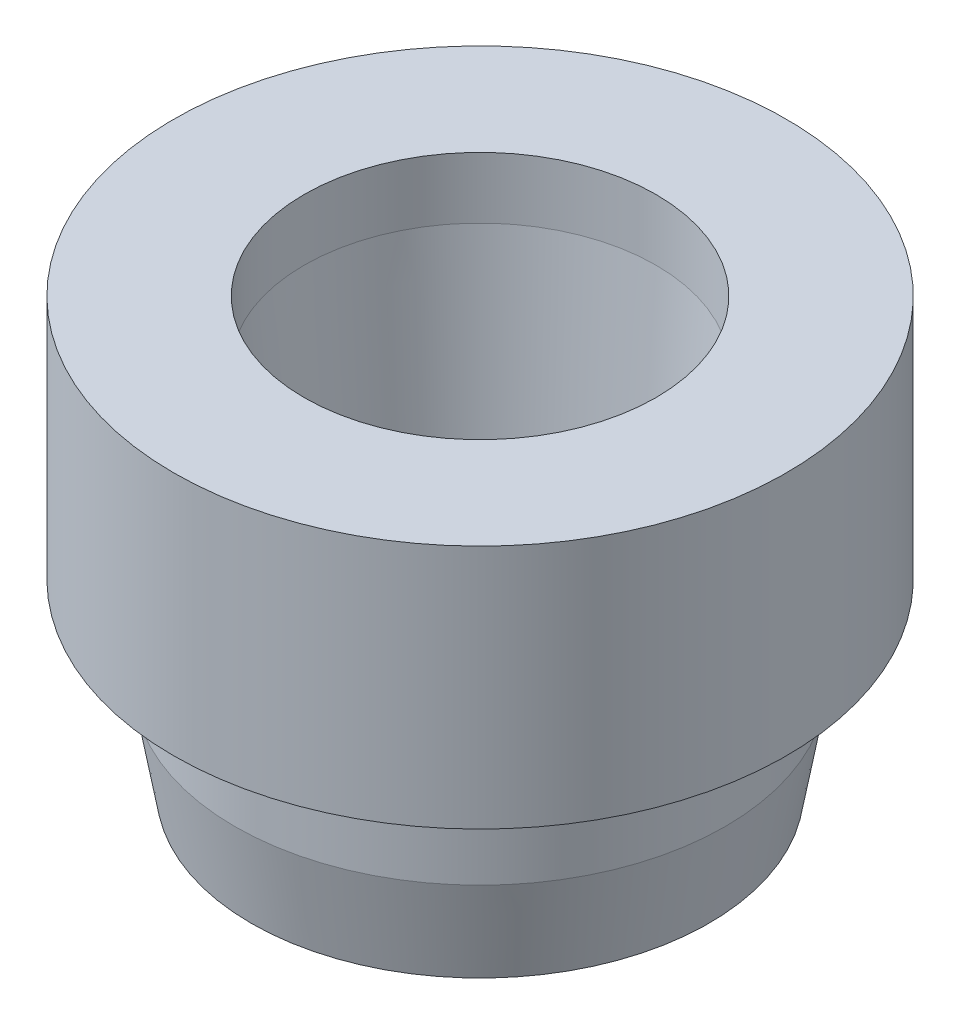
ISO-10303-21;
HEADER;
FILE_DESCRIPTION(('STEP AP214'),'2;1');
FILE_NAME('part.step','',(''),(''),'','','');
FILE_SCHEMA(('AUTOMOTIVE_DESIGN { 1 0 10303 214 1 1 1 1 }'));
ENDSEC;
DATA;
#1=APPLICATION_CONTEXT('core data for automotive mechanical design processes');
#2=APPLICATION_PROTOCOL_DEFINITION('international standard','automotive_design',2000,#1);
#3=PRODUCT_CONTEXT('',#1,'mechanical');
#4=PRODUCT('Part','Part','',(#3));
#5=PRODUCT_RELATED_PRODUCT_CATEGORY('part','',(#4));
#6=PRODUCT_DEFINITION_FORMATION('','',#4);
#7=PRODUCT_DEFINITION_CONTEXT('part definition',#1,'design');
#8=PRODUCT_DEFINITION('design','',#6,#7);
#9=PRODUCT_DEFINITION_SHAPE('','',#8);
#10=(LENGTH_UNIT() NAMED_UNIT(*) SI_UNIT(.MILLI.,.METRE.));
#11=(NAMED_UNIT(*) PLANE_ANGLE_UNIT() SI_UNIT($,.RADIAN.));
#12=(NAMED_UNIT(*) SI_UNIT($,.STERADIAN.) SOLID_ANGLE_UNIT());
#13=UNCERTAINTY_MEASURE_WITH_UNIT(LENGTH_MEASURE(1.E-05),#10,'distance_accuracy_value','');
#14=(GEOMETRIC_REPRESENTATION_CONTEXT(3) GLOBAL_UNCERTAINTY_ASSIGNED_CONTEXT((#13)) GLOBAL_UNIT_ASSIGNED_CONTEXT((#10,
#11,#12)) REPRESENTATION_CONTEXT('',''));
#15=CARTESIAN_POINT('',(0.,0.,0.));
#16=DIRECTION('',(0.,0.,1.));
#17=DIRECTION('',(1.,0.,0.));
#18=AXIS2_PLACEMENT_3D('',#15,#16,#17);
#19=CARTESIAN_POINT('',(-28.72,46.8801164725458,0.));
#20=DIRECTION('',(0.,1.,0.));
#21=DIRECTION('',(0.,0.,1.));
#22=AXIS2_PLACEMENT_3D('',#19,#20,#21);
#23=PLANE('',#22);
#24=CARTESIAN_POINT('',(0.,46.8801164725458,0.));
#25=DIRECTION('',(0.,1.,0.));
#26=DIRECTION('',(0.,0.,1.));
#27=AXIS2_PLACEMENT_3D('',#24,#25,#26);
#28=CIRCLE('',#27,50.);
#29=CARTESIAN_POINT('',(0.,46.8801164725458,50.));
#30=VERTEX_POINT('',#29);
#31=EDGE_CURVE('E10',#30,#30,#28,.T.);
#32=ORIENTED_EDGE('',*,*,#31,.T.);
#33=EDGE_LOOP('',(#32));
#34=FACE_BOUND('',#33,.T.);
#35=CARTESIAN_POINT('',(0.,46.8801164725458,0.));
#36=DIRECTION('',(0.,1.,0.));
#37=DIRECTION('',(0.,0.,1.));
#38=AXIS2_PLACEMENT_3D('',#35,#36,#37);
#39=CIRCLE('',#38,28.72);
#40=CARTESIAN_POINT('',(0.,46.8801164725458,28.72));
#41=VERTEX_POINT('',#40);
#42=EDGE_CURVE('E61',#41,#41,#39,.T.);
#43=ORIENTED_EDGE('',*,*,#42,.F.);
#44=EDGE_LOOP('',(#43));
#45=FACE_BOUND('',#44,.T.);
#46=ADVANCED_FACE('F30',(#34,#45),#23,.T.);
#47=CARTESIAN_POINT('',(0.,46.8801164725458,0.));
#48=DIRECTION('',(0.,1.,0.));
#49=DIRECTION('',(0.,0.,1.));
#50=AXIS2_PLACEMENT_3D('',#47,#48,#49);
#51=CYLINDRICAL_SURFACE('',#50,50.);
#52=CARTESIAN_POINT('',(0.,6.88011647254577,0.));
#53=DIRECTION('',(0.,1.,0.));
#54=DIRECTION('',(0.,0.,1.));
#55=AXIS2_PLACEMENT_3D('',#52,#53,#54);
#56=CIRCLE('',#55,50.);
#57=CARTESIAN_POINT('',(0.,6.88011647254577,50.));
#58=VERTEX_POINT('',#57);
#59=EDGE_CURVE('E36',#58,#58,#56,.T.);
#60=ORIENTED_EDGE('',*,*,#59,.T.);
#61=EDGE_LOOP('',(#60));
#62=FACE_BOUND('',#61,.T.);
#63=ORIENTED_EDGE('',*,*,#31,.F.);
#64=EDGE_LOOP('',(#63));
#65=FACE_BOUND('',#64,.T.);
#66=ADVANCED_FACE('F69',(#62,#65),#51,.T.);
#67=CARTESIAN_POINT('',(-50.,6.88011647254577,0.));
#68=DIRECTION('',(0.,-1.,0.));
#69=DIRECTION('',(0.,0.,-1.));
#70=AXIS2_PLACEMENT_3D('',#67,#68,#69);
#71=PLANE('',#70);
#72=CARTESIAN_POINT('',(0.,6.88011647254577,0.));
#73=DIRECTION('',(0.,1.,0.));
#74=DIRECTION('',(0.,0.,1.));
#75=AXIS2_PLACEMENT_3D('',#72,#73,#74);
#76=CIRCLE('',#75,40.);
#77=CARTESIAN_POINT('',(0.,6.88011647254577,40.));
#78=VERTEX_POINT('',#77);
#79=EDGE_CURVE('E40',#78,#78,#76,.T.);
#80=ORIENTED_EDGE('',*,*,#79,.T.);
#81=EDGE_LOOP('',(#80));
#82=FACE_BOUND('',#81,.T.);
#83=ORIENTED_EDGE('',*,*,#59,.F.);
#84=EDGE_LOOP('',(#83));
#85=FACE_BOUND('',#84,.T.);
#86=ADVANCED_FACE('F73',(#82,#85),#71,.T.);
#87=CARTESIAN_POINT('',(0.,46.8801164725458,0.));
#88=DIRECTION('',(0.,1.,0.));
#89=DIRECTION('',(0.,0.,1.));
#90=AXIS2_PLACEMENT_3D('',#87,#88,#89);
#91=CYLINDRICAL_SURFACE('',#90,40.);
#92=CARTESIAN_POINT('',(0.,-8.11988352745424,0.));
#93=DIRECTION('',(0.,1.,0.));
#94=DIRECTION('',(0.,0.,1.));
#95=AXIS2_PLACEMENT_3D('',#92,#93,#94);
#96=CIRCLE('',#95,40.);
#97=CARTESIAN_POINT('',(0.,-8.11988352745424,40.));
#98=VERTEX_POINT('',#97);
#99=EDGE_CURVE('E44',#98,#98,#96,.T.);
#100=ORIENTED_EDGE('',*,*,#99,.T.);
#101=EDGE_LOOP('',(#100));
#102=FACE_BOUND('',#101,.T.);
#103=ORIENTED_EDGE('',*,*,#79,.F.);
#104=EDGE_LOOP('',(#103));
#105=FACE_BOUND('',#104,.T.);
#106=ADVANCED_FACE('F77',(#102,#105),#91,.T.);
#107=CARTESIAN_POINT('',(0.,-8.11988352745424,0.));
#108=DIRECTION('',(0.,1.,0.));
#109=DIRECTION('',(0.,0.,1.));
#110=AXIS2_PLACEMENT_3D('',#107,#108,#109);
#111=CONICAL_SURFACE('',#110,40.,0.174532925199434);
#112=CARTESIAN_POINT('',(0.,-23.1198835274543,0.));
#113=DIRECTION('',(0.,1.,0.));
#114=DIRECTION('',(0.,0.,1.));
#115=AXIS2_PLACEMENT_3D('',#112,#113,#114);
#116=CIRCLE('',#115,37.355095289373);
#117=CARTESIAN_POINT('',(0.,-23.1198835274543,37.355095289373));
#118=VERTEX_POINT('',#117);
#119=EDGE_CURVE('E49',#118,#118,#116,.T.);
#120=ORIENTED_EDGE('',*,*,#119,.T.);
#121=EDGE_LOOP('',(#120));
#122=FACE_BOUND('',#121,.T.);
#123=ORIENTED_EDGE('',*,*,#99,.F.);
#124=EDGE_LOOP('',(#123));
#125=FACE_BOUND('',#124,.T.);
#126=ADVANCED_FACE('F84',(#122,#125),#111,.T.);
#127=CARTESIAN_POINT('',(-24.6970955192657,-23.1198835274543,0.));
#128=DIRECTION('',(0.,-1.,0.));
#129=DIRECTION('',(0.,0.,-1.));
#130=AXIS2_PLACEMENT_3D('',#127,#128,#129);
#131=PLANE('',#130);
#132=CARTESIAN_POINT('',(0.,-23.1198835274543,0.));
#133=DIRECTION('',(0.,1.,0.));
#134=DIRECTION('',(0.,0.,1.));
#135=AXIS2_PLACEMENT_3D('',#132,#133,#134);
#136=CIRCLE('',#135,24.6970955192657);
#137=CARTESIAN_POINT('',(0.,-23.1198835274543,24.6970955192657));
#138=VERTEX_POINT('',#137);
#139=EDGE_CURVE('E52',#138,#138,#136,.T.);
#140=ORIENTED_EDGE('',*,*,#139,.T.);
#141=EDGE_LOOP('',(#140));
#142=FACE_BOUND('',#141,.T.);
#143=ORIENTED_EDGE('',*,*,#119,.F.);
#144=EDGE_LOOP('',(#143));
#145=FACE_BOUND('',#144,.T.);
#146=ADVANCED_FACE('F88',(#142,#145),#131,.T.);
#147=CARTESIAN_POINT('',(0.,46.8801164725458,0.));
#148=DIRECTION('',(0.,1.,0.));
#149=DIRECTION('',(0.,0.,1.));
#150=AXIS2_PLACEMENT_3D('',#147,#148,#149);
#151=CYLINDRICAL_SURFACE('',#150,24.6970955192657);
#152=CARTESIAN_POINT('',(0.,-13.1198835274542,0.));
#153=DIRECTION('',(0.,1.,0.));
#154=DIRECTION('',(0.,0.,1.));
#155=AXIS2_PLACEMENT_3D('',#152,#153,#154);
#156=CIRCLE('',#155,24.6970955192657);
#157=CARTESIAN_POINT('',(0.,-13.1198835274542,24.6970955192657));
#158=VERTEX_POINT('',#157);
#159=EDGE_CURVE('E55',#158,#158,#156,.T.);
#160=ORIENTED_EDGE('',*,*,#159,.T.);
#161=EDGE_LOOP('',(#160));
#162=FACE_BOUND('',#161,.T.);
#163=ORIENTED_EDGE('',*,*,#139,.F.);
#164=EDGE_LOOP('',(#163));
#165=FACE_BOUND('',#164,.T.);
#166=ADVANCED_FACE('F92',(#162,#165),#151,.F.);
#167=CARTESIAN_POINT('',(0.,-13.1198835274542,0.));
#168=DIRECTION('',(0.,1.,0.));
#169=DIRECTION('',(0.,0.,1.));
#170=AXIS2_PLACEMENT_3D('',#167,#168,#169);
#171=CONICAL_SURFACE('',#170,24.6970955192657,0.0802851455917399);
#172=CARTESIAN_POINT('',(0.,36.8801164725457,0.));
#173=DIRECTION('',(0.,1.,0.));
#174=DIRECTION('',(0.,0.,1.));
#175=AXIS2_PLACEMENT_3D('',#172,#173,#174);
#176=CIRCLE('',#175,28.72);
#177=CARTESIAN_POINT('',(0.,36.8801164725457,28.72));
#178=VERTEX_POINT('',#177);
#179=EDGE_CURVE('E58',#178,#178,#176,.T.);
#180=ORIENTED_EDGE('',*,*,#179,.T.);
#181=EDGE_LOOP('',(#180));
#182=FACE_BOUND('',#181,.T.);
#183=ORIENTED_EDGE('',*,*,#159,.F.);
#184=EDGE_LOOP('',(#183));
#185=FACE_BOUND('',#184,.T.);
#186=ADVANCED_FACE('F96',(#182,#185),#171,.F.);
#187=CARTESIAN_POINT('',(0.,46.8801164725458,0.));
#188=DIRECTION('',(0.,1.,0.));
#189=DIRECTION('',(0.,0.,1.));
#190=AXIS2_PLACEMENT_3D('',#187,#188,#189);
#191=CYLINDRICAL_SURFACE('',#190,28.72);
#192=ORIENTED_EDGE('',*,*,#42,.T.);
#193=EDGE_LOOP('',(#192));
#194=FACE_BOUND('',#193,.T.);
#195=ORIENTED_EDGE('',*,*,#179,.F.);
#196=EDGE_LOOP('',(#195));
#197=FACE_BOUND('',#196,.T.);
#198=ADVANCED_FACE('F65',(#194,#197),#191,.F.);
#199=CLOSED_SHELL('',(#46,#66,#86,#106,#126,#146,#166,#186,#198));
#200=MANIFOLD_SOLID_BREP('B2',#199);
#201=ADVANCED_BREP_SHAPE_REPRESENTATION('',(#18,#200),#14);
#202=SHAPE_DEFINITION_REPRESENTATION(#9,#201);
ENDSEC;
END-ISO-10303-21;
